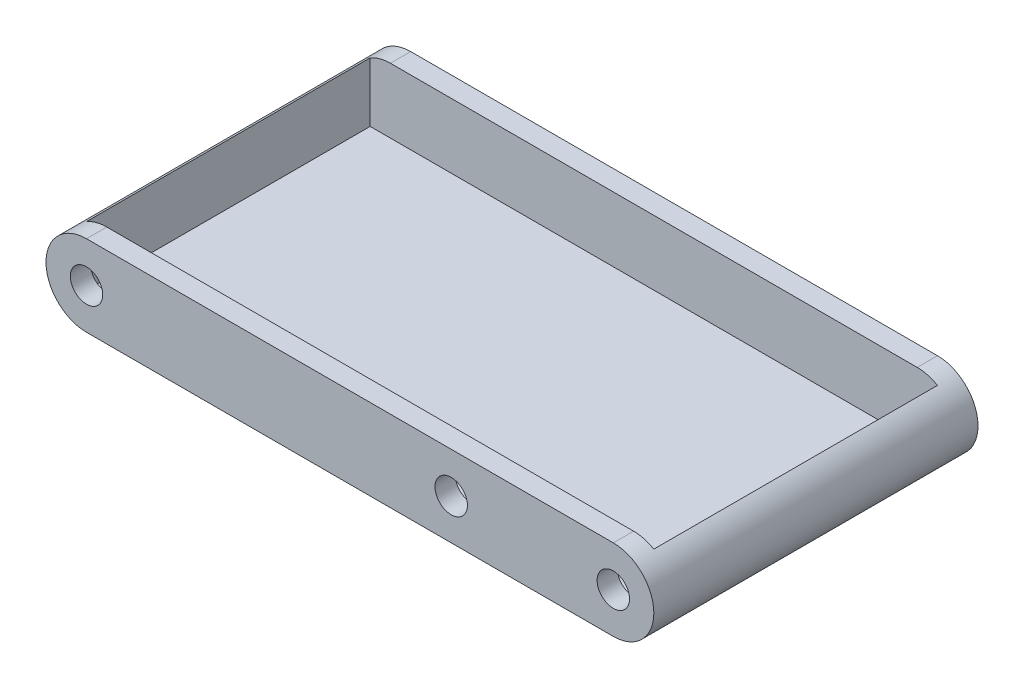
ISO-10303-21;
HEADER;
FILE_DESCRIPTION(('STEP AP214'),'2;1');
FILE_NAME('part.step','',(''),(''),'','','');
FILE_SCHEMA(('AUTOMOTIVE_DESIGN { 1 0 10303 214 1 1 1 1 }'));
ENDSEC;
DATA;
#1=APPLICATION_CONTEXT('core data for automotive mechanical design processes');
#2=APPLICATION_PROTOCOL_DEFINITION('international standard','automotive_design',2000,#1);
#3=PRODUCT_CONTEXT('',#1,'mechanical');
#4=PRODUCT('Part','Part','',(#3));
#5=PRODUCT_RELATED_PRODUCT_CATEGORY('part','',(#4));
#6=PRODUCT_DEFINITION_FORMATION('','',#4);
#7=PRODUCT_DEFINITION_CONTEXT('part definition',#1,'design');
#8=PRODUCT_DEFINITION('design','',#6,#7);
#9=PRODUCT_DEFINITION_SHAPE('','',#8);
#10=(LENGTH_UNIT() NAMED_UNIT(*) SI_UNIT(.MILLI.,.METRE.));
#11=(NAMED_UNIT(*) PLANE_ANGLE_UNIT() SI_UNIT($,.RADIAN.));
#12=(NAMED_UNIT(*) SI_UNIT($,.STERADIAN.) SOLID_ANGLE_UNIT());
#13=UNCERTAINTY_MEASURE_WITH_UNIT(LENGTH_MEASURE(1.E-05),#10,'distance_accuracy_value','');
#14=(GEOMETRIC_REPRESENTATION_CONTEXT(3) GLOBAL_UNCERTAINTY_ASSIGNED_CONTEXT((#13)) GLOBAL_UNIT_ASSIGNED_CONTEXT((#10,
#11,#12)) REPRESENTATION_CONTEXT('',''));
#15=CARTESIAN_POINT('',(0.,0.,0.));
#16=DIRECTION('',(0.,0.,1.));
#17=DIRECTION('',(1.,0.,0.));
#18=AXIS2_PLACEMENT_3D('',#15,#16,#17);
#19=CARTESIAN_POINT('',(-65.,-3.17989131925002E-13,40.));
#20=DIRECTION('',(0.,0.,-1.));
#21=DIRECTION('',(-1.,0.,0.));
#22=AXIS2_PLACEMENT_3D('',#19,#20,#21);
#23=CYLINDRICAL_SURFACE('',#22,10.0000000000001);
#24=CARTESIAN_POINT('',(-65.,-3.17989131925002E-13,-35.));
#25=DIRECTION('',(0.,0.,1.));
#26=DIRECTION('',(1.,0.,0.));
#27=AXIS2_PLACEMENT_3D('',#24,#25,#26);
#28=CIRCLE('',#27,10.0000000000001);
#29=CARTESIAN_POINT('',(-65.,9.99999999999975,-35.));
#30=VERTEX_POINT('',#29);
#31=CARTESIAN_POINT('',(-70.0000000000001,8.66025403784413,-35.));
#32=VERTEX_POINT('',#31);
#33=EDGE_CURVE('E175',#30,#32,#28,.T.);
#34=ORIENTED_EDGE('',*,*,#33,.F.);
#35=DIRECTION('',(0.,0.,-1.));
#36=VECTOR('',#35,1.);
#37=CARTESIAN_POINT('',(-65.,9.99999999999976,40.));
#38=LINE('',#37,#36);
#39=CARTESIAN_POINT('',(-65.,9.99999999999976,-40.));
#40=VERTEX_POINT('',#39);
#41=EDGE_CURVE('E205',#30,#40,#38,.T.);
#42=ORIENTED_EDGE('',*,*,#41,.T.);
#43=CARTESIAN_POINT('',(-65.,-3.17989131925002E-13,-40.));
#44=DIRECTION('',(0.,0.,1.));
#45=DIRECTION('',(1.,0.,0.));
#46=AXIS2_PLACEMENT_3D('',#43,#44,#45);
#47=CIRCLE('',#46,10.0000000000001);
#48=CARTESIAN_POINT('',(-65.,-10.0000000000005,-40.));
#49=VERTEX_POINT('',#48);
#50=EDGE_CURVE('E178',#40,#49,#47,.T.);
#51=ORIENTED_EDGE('',*,*,#50,.T.);
#52=DIRECTION('',(0.,0.,-1.));
#53=VECTOR('',#52,1.);
#54=CARTESIAN_POINT('',(-65.,-10.0000000000005,40.));
#55=LINE('',#54,#53);
#56=CARTESIAN_POINT('',(-65.,-10.0000000000005,40.));
#57=VERTEX_POINT('',#56);
#58=EDGE_CURVE('E218',#57,#49,#55,.T.);
#59=ORIENTED_EDGE('',*,*,#58,.F.);
#60=CARTESIAN_POINT('',(-65.,-3.17989131925002E-13,40.));
#61=DIRECTION('',(0.,0.,1.));
#62=DIRECTION('',(1.,0.,0.));
#63=AXIS2_PLACEMENT_3D('',#60,#61,#62);
#64=CIRCLE('',#63,10.0000000000001);
#65=CARTESIAN_POINT('',(-65.,9.99999999999976,40.));
#66=VERTEX_POINT('',#65);
#67=EDGE_CURVE('E194',#66,#57,#64,.T.);
#68=ORIENTED_EDGE('',*,*,#67,.F.);
#69=CARTESIAN_POINT('',(-65.,9.99999999999976,35.));
#70=VERTEX_POINT('',#69);
#71=EDGE_CURVE('E206',#66,#70,#38,.T.);
#72=ORIENTED_EDGE('',*,*,#71,.T.);
#73=CARTESIAN_POINT('',(-65.,-3.17989131925002E-13,35.));
#74=DIRECTION('',(0.,0.,1.));
#75=DIRECTION('',(1.,0.,0.));
#76=AXIS2_PLACEMENT_3D('',#73,#74,#75);
#77=CIRCLE('',#76,10.0000000000001);
#78=CARTESIAN_POINT('',(-70.0000000000001,8.66025403784414,35.));
#79=VERTEX_POINT('',#78);
#80=EDGE_CURVE('E57',#70,#79,#77,.T.);
#81=ORIENTED_EDGE('',*,*,#80,.T.);
#82=DIRECTION('',(0.,0.,-1.));
#83=VECTOR('',#82,1.);
#84=CARTESIAN_POINT('',(-70.0000000000001,8.66025403784414,40.));
#85=LINE('',#84,#83);
#86=EDGE_CURVE('E11',#79,#32,#85,.T.);
#87=ORIENTED_EDGE('',*,*,#86,.T.);
#88=EDGE_LOOP('',(#34,#42,#51,#59,#68,#72,#81,#87));
#89=FACE_BOUND('',#88,.T.);
#90=ADVANCED_FACE('F42',(#89),#23,.T.);
#91=CARTESIAN_POINT('',(65.,-3.17989131925002E-13,40.));
#92=DIRECTION('',(0.,0.,-1.));
#93=DIRECTION('',(-1.,0.,0.));
#94=AXIS2_PLACEMENT_3D('',#91,#92,#93);
#95=CYLINDRICAL_SURFACE('',#94,10.0000000000001);
#96=CARTESIAN_POINT('',(65.,-3.17989131925002E-13,-35.));
#97=DIRECTION('',(0.,0.,1.));
#98=DIRECTION('',(1.,0.,0.));
#99=AXIS2_PLACEMENT_3D('',#96,#97,#98);
#100=CIRCLE('',#99,10.0000000000001);
#101=CARTESIAN_POINT('',(70.0000000000001,8.66025403784414,-35.));
#102=VERTEX_POINT('',#101);
#103=CARTESIAN_POINT('',(65.,9.9999999999998,-35.));
#104=VERTEX_POINT('',#103);
#105=EDGE_CURVE('E172',#102,#104,#100,.T.);
#106=ORIENTED_EDGE('',*,*,#105,.F.);
#107=DIRECTION('',(0.,0.,-1.));
#108=VECTOR('',#107,1.);
#109=CARTESIAN_POINT('',(70.0000000000001,8.66025403784414,40.));
#110=LINE('',#109,#108);
#111=CARTESIAN_POINT('',(70.0000000000001,8.66025403784414,35.));
#112=VERTEX_POINT('',#111);
#113=EDGE_CURVE('E50',#112,#102,#110,.T.);
#114=ORIENTED_EDGE('',*,*,#113,.F.);
#115=CARTESIAN_POINT('',(65.,-3.17989131925002E-13,35.));
#116=DIRECTION('',(0.,0.,1.));
#117=DIRECTION('',(1.,0.,0.));
#118=AXIS2_PLACEMENT_3D('',#115,#116,#117);
#119=CIRCLE('',#118,10.0000000000001);
#120=CARTESIAN_POINT('',(65.,9.9999999999998,35.));
#121=VERTEX_POINT('',#120);
#122=EDGE_CURVE('E160',#112,#121,#119,.T.);
#123=ORIENTED_EDGE('',*,*,#122,.T.);
#124=DIRECTION('',(0.,0.,-1.));
#125=VECTOR('',#124,1.);
#126=CARTESIAN_POINT('',(65.,9.99999999999979,40.));
#127=LINE('',#126,#125);
#128=CARTESIAN_POINT('',(65.,9.99999999999979,40.));
#129=VERTEX_POINT('',#128);
#130=EDGE_CURVE('E211',#129,#121,#127,.T.);
#131=ORIENTED_EDGE('',*,*,#130,.F.);
#132=CARTESIAN_POINT('',(65.,-3.17989131925002E-13,40.));
#133=DIRECTION('',(0.,0.,1.));
#134=DIRECTION('',(1.,0.,0.));
#135=AXIS2_PLACEMENT_3D('',#132,#133,#134);
#136=CIRCLE('',#135,10.0000000000001);
#137=CARTESIAN_POINT('',(65.,-10.0000000000004,40.));
#138=VERTEX_POINT('',#137);
#139=EDGE_CURVE('E200',#138,#129,#136,.T.);
#140=ORIENTED_EDGE('',*,*,#139,.F.);
#141=DIRECTION('',(0.,0.,-1.));
#142=VECTOR('',#141,1.);
#143=CARTESIAN_POINT('',(65.,-10.0000000000004,40.));
#144=LINE('',#143,#142);
#145=CARTESIAN_POINT('',(65.,-10.0000000000004,-40.));
#146=VERTEX_POINT('',#145);
#147=EDGE_CURVE('E215',#138,#146,#144,.T.);
#148=ORIENTED_EDGE('',*,*,#147,.T.);
#149=CARTESIAN_POINT('',(65.,-3.17989131925002E-13,-40.));
#150=DIRECTION('',(0.,0.,1.));
#151=DIRECTION('',(1.,0.,0.));
#152=AXIS2_PLACEMENT_3D('',#149,#150,#151);
#153=CIRCLE('',#152,10.0000000000001);
#154=CARTESIAN_POINT('',(65.,9.99999999999979,-40.));
#155=VERTEX_POINT('',#154);
#156=EDGE_CURVE('E186',#146,#155,#153,.T.);
#157=ORIENTED_EDGE('',*,*,#156,.T.);
#158=EDGE_CURVE('E210',#104,#155,#127,.T.);
#159=ORIENTED_EDGE('',*,*,#158,.F.);
#160=EDGE_LOOP('',(#106,#114,#123,#131,#140,#148,#157,#159));
#161=FACE_BOUND('',#160,.T.);
#162=ADVANCED_FACE('F237',(#161),#95,.T.);
#163=CARTESIAN_POINT('',(-65.,9.99999999999976,40.));
#164=DIRECTION('',(0.,-1.,0.));
#165=DIRECTION('',(1.,0.,0.));
#166=AXIS2_PLACEMENT_3D('',#163,#164,#165);
#167=PLANE('',#166);
#168=DIRECTION('',(-1.,0.,0.));
#169=VECTOR('',#168,1.);
#170=CARTESIAN_POINT('',(-65.,9.99999999999976,-35.));
#171=LINE('',#170,#169);
#172=EDGE_CURVE('E224',#104,#30,#171,.T.);
#173=ORIENTED_EDGE('',*,*,#172,.F.);
#174=ORIENTED_EDGE('',*,*,#158,.T.);
#175=DIRECTION('',(-1.,0.,0.));
#176=VECTOR('',#175,1.);
#177=CARTESIAN_POINT('',(-65.,9.99999999999976,-40.));
#178=LINE('',#177,#176);
#179=EDGE_CURVE('E190',#155,#40,#178,.T.);
#180=ORIENTED_EDGE('',*,*,#179,.T.);
#181=ORIENTED_EDGE('',*,*,#41,.F.);
#182=EDGE_LOOP('',(#173,#174,#180,#181));
#183=FACE_BOUND('',#182,.T.);
#184=ADVANCED_FACE('F251',(#183),#167,.F.);
#185=CARTESIAN_POINT('',(-65.,-10.0000000000005,40.));
#186=DIRECTION('',(0.,1.,0.));
#187=DIRECTION('',(-1.,0.,0.));
#188=AXIS2_PLACEMENT_3D('',#185,#186,#187);
#189=PLANE('',#188);
#190=ORIENTED_EDGE('',*,*,#58,.T.);
#191=DIRECTION('',(1.,0.,0.));
#192=VECTOR('',#191,1.);
#193=CARTESIAN_POINT('',(-65.,-10.0000000000005,-40.));
#194=LINE('',#193,#192);
#195=EDGE_CURVE('E182',#49,#146,#194,.T.);
#196=ORIENTED_EDGE('',*,*,#195,.T.);
#197=ORIENTED_EDGE('',*,*,#147,.F.);
#198=DIRECTION('',(1.,0.,0.));
#199=VECTOR('',#198,1.);
#200=CARTESIAN_POINT('',(-65.,-10.0000000000005,40.));
#201=LINE('',#200,#199);
#202=EDGE_CURVE('E197',#57,#138,#201,.T.);
#203=ORIENTED_EDGE('',*,*,#202,.F.);
#204=EDGE_LOOP('',(#190,#196,#197,#203));
#205=FACE_BOUND('',#204,.T.);
#206=ADVANCED_FACE('F253',(#205),#189,.F.);
#207=ORIENTED_EDGE('',*,*,#130,.T.);
#208=DIRECTION('',(-1.,0.,0.));
#209=VECTOR('',#208,1.);
#210=CARTESIAN_POINT('',(-65.,9.99999999999976,35.));
#211=LINE('',#210,#209);
#212=EDGE_CURVE('E221',#121,#70,#211,.T.);
#213=ORIENTED_EDGE('',*,*,#212,.T.);
#214=ORIENTED_EDGE('',*,*,#71,.F.);
#215=DIRECTION('',(-1.,0.,0.));
#216=VECTOR('',#215,1.);
#217=CARTESIAN_POINT('',(-65.,9.99999999999976,40.));
#218=LINE('',#217,#216);
#219=EDGE_CURVE('E65',#129,#66,#218,.T.);
#220=ORIENTED_EDGE('',*,*,#219,.F.);
#221=EDGE_LOOP('',(#207,#213,#214,#220));
#222=FACE_BOUND('',#221,.T.);
#223=ADVANCED_FACE('F255',(#222),#167,.F.);
#224=CARTESIAN_POINT('',(-65.,-3.17989131925002E-13,40.));
#225=DIRECTION('',(0.,0.,1.));
#226=DIRECTION('',(1.,0.,0.));
#227=AXIS2_PLACEMENT_3D('',#224,#225,#226);
#228=PLANE('',#227);
#229=CARTESIAN_POINT('',(65.,-3.17989131925002E-13,40.));
#230=DIRECTION('',(0.,0.,1.));
#231=DIRECTION('',(1.,0.,0.));
#232=AXIS2_PLACEMENT_3D('',#229,#230,#231);
#233=CIRCLE('',#232,4.00000000000001);
#234=CARTESIAN_POINT('',(69.,-3.17989131925002E-13,40.));
#235=VERTEX_POINT('',#234);
#236=EDGE_CURVE('E147',#235,#235,#233,.T.);
#237=ORIENTED_EDGE('',*,*,#236,.F.);
#238=EDGE_LOOP('',(#237));
#239=FACE_BOUND('',#238,.T.);
#240=CARTESIAN_POINT('',(-65.,-3.17989131925002E-13,40.));
#241=DIRECTION('',(0.,0.,1.));
#242=DIRECTION('',(1.,0.,0.));
#243=AXIS2_PLACEMENT_3D('',#240,#241,#242);
#244=CIRCLE('',#243,4.00000000000001);
#245=CARTESIAN_POINT('',(-61.,-3.17989131925002E-13,40.));
#246=VERTEX_POINT('',#245);
#247=EDGE_CURVE('E417',#246,#246,#244,.T.);
#248=ORIENTED_EDGE('',*,*,#247,.F.);
#249=EDGE_LOOP('',(#248));
#250=FACE_BOUND('',#249,.T.);
#251=CARTESIAN_POINT('',(25.,0.,40.));
#252=DIRECTION('',(0.,0.,1.));
#253=DIRECTION('',(1.,0.,0.));
#254=AXIS2_PLACEMENT_3D('',#251,#252,#253);
#255=CIRCLE('',#254,4.);
#256=CARTESIAN_POINT('',(29.,0.,40.));
#257=VERTEX_POINT('',#256);
#258=EDGE_CURVE('E150',#257,#257,#255,.T.);
#259=ORIENTED_EDGE('',*,*,#258,.F.);
#260=EDGE_LOOP('',(#259));
#261=FACE_BOUND('',#260,.T.);
#262=ORIENTED_EDGE('',*,*,#67,.T.);
#263=ORIENTED_EDGE('',*,*,#202,.T.);
#264=ORIENTED_EDGE('',*,*,#139,.T.);
#265=ORIENTED_EDGE('',*,*,#219,.T.);
#266=EDGE_LOOP('',(#262,#263,#264,#265));
#267=FACE_BOUND('',#266,.T.);
#268=ADVANCED_FACE('F264',(#239,#250,#261,#267),#228,.T.);
#269=CARTESIAN_POINT('',(-65.,-3.17989131925002E-13,-40.));
#270=DIRECTION('',(0.,0.,1.));
#271=DIRECTION('',(1.,0.,0.));
#272=AXIS2_PLACEMENT_3D('',#269,#270,#271);
#273=PLANE('',#272);
#274=ORIENTED_EDGE('',*,*,#50,.F.);
#275=ORIENTED_EDGE('',*,*,#179,.F.);
#276=ORIENTED_EDGE('',*,*,#156,.F.);
#277=ORIENTED_EDGE('',*,*,#195,.F.);
#278=EDGE_LOOP('',(#274,#275,#276,#277));
#279=FACE_BOUND('',#278,.T.);
#280=ADVANCED_FACE('F250',(#279),#273,.F.);
#281=CARTESIAN_POINT('',(-70.0000000000001,-6.00000000000026,-35.));
#282=DIRECTION('',(-1.,0.,0.));
#283=DIRECTION('',(0.,-1.,0.));
#284=AXIS2_PLACEMENT_3D('',#281,#282,#283);
#285=PLANE('',#284);
#286=DIRECTION('',(0.,1.,0.));
#287=VECTOR('',#286,1.);
#288=CARTESIAN_POINT('',(-70.0000000000001,-6.00000000000026,35.));
#289=LINE('',#288,#287);
#290=CARTESIAN_POINT('',(-70.0000000000001,-6.00000000000026,35.));
#291=VERTEX_POINT('',#290);
#292=EDGE_CURVE('E120',#291,#79,#289,.T.);
#293=ORIENTED_EDGE('',*,*,#292,.F.);
#294=DIRECTION('',(0.,0.,1.));
#295=VECTOR('',#294,1.);
#296=CARTESIAN_POINT('',(-70.0000000000001,-6.00000000000026,-35.));
#297=LINE('',#296,#295);
#298=CARTESIAN_POINT('',(-70.0000000000001,-6.00000000000026,-35.));
#299=VERTEX_POINT('',#298);
#300=EDGE_CURVE('E125',#299,#291,#297,.T.);
#301=ORIENTED_EDGE('',*,*,#300,.F.);
#302=DIRECTION('',(0.,1.,0.));
#303=VECTOR('',#302,1.);
#304=CARTESIAN_POINT('',(-70.0000000000001,-6.00000000000026,-35.));
#305=LINE('',#304,#303);
#306=EDGE_CURVE('E157',#299,#32,#305,.T.);
#307=ORIENTED_EDGE('',*,*,#306,.T.);
#308=ORIENTED_EDGE('',*,*,#86,.F.);
#309=EDGE_LOOP('',(#293,#301,#307,#308));
#310=FACE_BOUND('',#309,.T.);
#311=ADVANCED_FACE('F122',(#310),#285,.F.);
#312=CARTESIAN_POINT('',(70.0000000000001,-6.00000000000021,-35.));
#313=DIRECTION('',(-1.,0.,0.));
#314=DIRECTION('',(0.,0.,1.));
#315=AXIS2_PLACEMENT_3D('',#312,#313,#314);
#316=PLANE('',#315);
#317=ORIENTED_EDGE('',*,*,#113,.T.);
#318=DIRECTION('',(0.,1.,0.));
#319=VECTOR('',#318,1.);
#320=CARTESIAN_POINT('',(70.0000000000001,-6.00000000000021,-35.));
#321=LINE('',#320,#319);
#322=CARTESIAN_POINT('',(70.0000000000001,-6.00000000000021,-35.));
#323=VERTEX_POINT('',#322);
#324=EDGE_CURVE('E161',#323,#102,#321,.T.);
#325=ORIENTED_EDGE('',*,*,#324,.F.);
#326=DIRECTION('',(0.,0.,1.));
#327=VECTOR('',#326,1.);
#328=CARTESIAN_POINT('',(70.0000000000001,-6.00000000000021,-35.));
#329=LINE('',#328,#327);
#330=CARTESIAN_POINT('',(70.0000000000001,-6.00000000000021,35.));
#331=VERTEX_POINT('',#330);
#332=EDGE_CURVE('E138',#323,#331,#329,.T.);
#333=ORIENTED_EDGE('',*,*,#332,.T.);
#334=DIRECTION('',(0.,1.,0.));
#335=VECTOR('',#334,1.);
#336=CARTESIAN_POINT('',(70.0000000000001,-6.00000000000021,35.));
#337=LINE('',#336,#335);
#338=EDGE_CURVE('E127',#331,#112,#337,.T.);
#339=ORIENTED_EDGE('',*,*,#338,.T.);
#340=EDGE_LOOP('',(#317,#325,#333,#339));
#341=FACE_BOUND('',#340,.T.);
#342=ADVANCED_FACE('F230',(#341),#316,.T.);
#343=CARTESIAN_POINT('',(-70.0000000000001,-6.00000000000026,-35.));
#344=DIRECTION('',(0.,0.,1.));
#345=DIRECTION('',(1.,0.,0.));
#346=AXIS2_PLACEMENT_3D('',#343,#344,#345);
#347=PLANE('',#346);
#348=ORIENTED_EDGE('',*,*,#33,.T.);
#349=ORIENTED_EDGE('',*,*,#306,.F.);
#350=DIRECTION('',(1.,0.,0.));
#351=VECTOR('',#350,1.);
#352=CARTESIAN_POINT('',(-70.0000000000001,-6.00000000000026,-35.));
#353=LINE('',#352,#351);
#354=EDGE_CURVE('E128',#299,#323,#353,.T.);
#355=ORIENTED_EDGE('',*,*,#354,.T.);
#356=ORIENTED_EDGE('',*,*,#324,.T.);
#357=ORIENTED_EDGE('',*,*,#105,.T.);
#358=ORIENTED_EDGE('',*,*,#172,.T.);
#359=EDGE_LOOP('',(#348,#349,#355,#356,#357,#358));
#360=FACE_BOUND('',#359,.T.);
#361=ADVANCED_FACE('F234',(#360),#347,.T.);
#362=CARTESIAN_POINT('',(-70.0000000000001,-6.00000000000026,35.));
#363=DIRECTION('',(0.,0.,1.));
#364=DIRECTION('',(1.,0.,0.));
#365=AXIS2_PLACEMENT_3D('',#362,#363,#364);
#366=PLANE('',#365);
#367=CARTESIAN_POINT('',(65.,-3.17989131925002E-13,35.));
#368=DIRECTION('',(0.,0.,1.));
#369=DIRECTION('',(1.,0.,0.));
#370=AXIS2_PLACEMENT_3D('',#367,#368,#369);
#371=CIRCLE('',#370,4.00000000000001);
#372=CARTESIAN_POINT('',(69.,-3.17989131925002E-13,35.));
#373=VERTEX_POINT('',#372);
#374=EDGE_CURVE('E143',#373,#373,#371,.F.);
#375=ORIENTED_EDGE('',*,*,#374,.F.);
#376=EDGE_LOOP('',(#375));
#377=FACE_BOUND('',#376,.T.);
#378=CARTESIAN_POINT('',(-65.,-3.17989131925002E-13,35.));
#379=DIRECTION('',(0.,0.,1.));
#380=DIRECTION('',(1.,0.,0.));
#381=AXIS2_PLACEMENT_3D('',#378,#379,#380);
#382=CIRCLE('',#381,4.00000000000001);
#383=CARTESIAN_POINT('',(-61.,-3.17989131925002E-13,35.));
#384=VERTEX_POINT('',#383);
#385=EDGE_CURVE('E421',#384,#384,#382,.F.);
#386=ORIENTED_EDGE('',*,*,#385,.F.);
#387=EDGE_LOOP('',(#386));
#388=FACE_BOUND('',#387,.T.);
#389=CARTESIAN_POINT('',(25.,0.,35.));
#390=DIRECTION('',(0.,0.,1.));
#391=DIRECTION('',(1.,0.,0.));
#392=AXIS2_PLACEMENT_3D('',#389,#390,#391);
#393=CIRCLE('',#392,4.);
#394=CARTESIAN_POINT('',(29.,0.,35.));
#395=VERTEX_POINT('',#394);
#396=EDGE_CURVE('E426',#395,#395,#393,.F.);
#397=ORIENTED_EDGE('',*,*,#396,.F.);
#398=EDGE_LOOP('',(#397));
#399=FACE_BOUND('',#398,.T.);
#400=ORIENTED_EDGE('',*,*,#212,.F.);
#401=ORIENTED_EDGE('',*,*,#122,.F.);
#402=ORIENTED_EDGE('',*,*,#338,.F.);
#403=DIRECTION('',(1.,0.,0.));
#404=VECTOR('',#403,1.);
#405=CARTESIAN_POINT('',(-70.0000000000001,-6.00000000000026,35.));
#406=LINE('',#405,#404);
#407=EDGE_CURVE('E132',#291,#331,#406,.T.);
#408=ORIENTED_EDGE('',*,*,#407,.F.);
#409=ORIENTED_EDGE('',*,*,#292,.T.);
#410=ORIENTED_EDGE('',*,*,#80,.F.);
#411=EDGE_LOOP('',(#400,#401,#402,#408,#409,#410));
#412=FACE_BOUND('',#411,.T.);
#413=ADVANCED_FACE('F133',(#377,#388,#399,#412),#366,.F.);
#414=CARTESIAN_POINT('',(0.,-6.00000000000023,0.));
#415=DIRECTION('',(0.,1.,0.));
#416=DIRECTION('',(-1.,0.,0.));
#417=AXIS2_PLACEMENT_3D('',#414,#415,#416);
#418=PLANE('',#417);
#419=ORIENTED_EDGE('',*,*,#300,.T.);
#420=ORIENTED_EDGE('',*,*,#407,.T.);
#421=ORIENTED_EDGE('',*,*,#332,.F.);
#422=ORIENTED_EDGE('',*,*,#354,.F.);
#423=EDGE_LOOP('',(#419,#420,#421,#422));
#424=FACE_BOUND('',#423,.T.);
#425=ADVANCED_FACE('F141',(#424),#418,.T.);
#426=CARTESIAN_POINT('',(25.,0.,23.6862915010152));
#427=DIRECTION('',(0.,0.,1.));
#428=DIRECTION('',(1.,0.,0.));
#429=AXIS2_PLACEMENT_3D('',#426,#427,#428);
#430=CYLINDRICAL_SURFACE('',#429,4.);
#431=ORIENTED_EDGE('',*,*,#396,.T.);
#432=EDGE_LOOP('',(#431));
#433=FACE_BOUND('',#432,.T.);
#434=ORIENTED_EDGE('',*,*,#258,.T.);
#435=EDGE_LOOP('',(#434));
#436=FACE_BOUND('',#435,.T.);
#437=ADVANCED_FACE('F330',(#433,#436),#430,.F.);
#438=CARTESIAN_POINT('',(-65.,-3.17989131925002E-13,23.6862915010152));
#439=DIRECTION('',(0.,0.,1.));
#440=DIRECTION('',(1.,0.,0.));
#441=AXIS2_PLACEMENT_3D('',#438,#439,#440);
#442=CYLINDRICAL_SURFACE('',#441,4.00000000000001);
#443=ORIENTED_EDGE('',*,*,#385,.T.);
#444=EDGE_LOOP('',(#443));
#445=FACE_BOUND('',#444,.T.);
#446=ORIENTED_EDGE('',*,*,#247,.T.);
#447=EDGE_LOOP('',(#446));
#448=FACE_BOUND('',#447,.T.);
#449=ADVANCED_FACE('F349',(#445,#448),#442,.F.);
#450=CARTESIAN_POINT('',(65.,-3.17989131925002E-13,23.6862915010152));
#451=DIRECTION('',(0.,0.,1.));
#452=DIRECTION('',(1.,0.,0.));
#453=AXIS2_PLACEMENT_3D('',#450,#451,#452);
#454=CYLINDRICAL_SURFACE('',#453,4.00000000000001);
#455=ORIENTED_EDGE('',*,*,#374,.T.);
#456=EDGE_LOOP('',(#455));
#457=FACE_BOUND('',#456,.T.);
#458=ORIENTED_EDGE('',*,*,#236,.T.);
#459=EDGE_LOOP('',(#458));
#460=FACE_BOUND('',#459,.T.);
#461=ADVANCED_FACE('F360',(#457,#460),#454,.F.);
#462=CLOSED_SHELL('',(#90,#162,#184,#206,#223,#268,#280,#311,#342,#361,#413,#425,#437,#449,#461));
#463=MANIFOLD_SOLID_BREP('B2',#462);
#464=ADVANCED_BREP_SHAPE_REPRESENTATION('',(#18,#463),#14);
#465=SHAPE_DEFINITION_REPRESENTATION(#9,#464);
ENDSEC;
END-ISO-10303-21;
